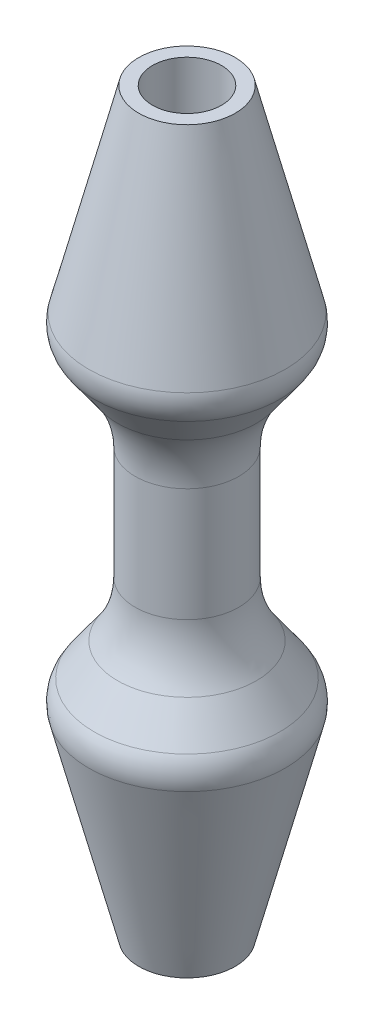
ISO-10303-21;
HEADER;
FILE_DESCRIPTION(('STEP AP214'),'2;1');
FILE_NAME('part.step','',(''),(''),'','','');
FILE_SCHEMA(('AUTOMOTIVE_DESIGN { 1 0 10303 214 1 1 1 1 }'));
ENDSEC;
DATA;
#1=APPLICATION_CONTEXT('core data for automotive mechanical design processes');
#2=APPLICATION_PROTOCOL_DEFINITION('international standard','automotive_design',2000,#1);
#3=PRODUCT_CONTEXT('',#1,'mechanical');
#4=PRODUCT('Part','Part','',(#3));
#5=PRODUCT_RELATED_PRODUCT_CATEGORY('part','',(#4));
#6=PRODUCT_DEFINITION_FORMATION('','',#4);
#7=PRODUCT_DEFINITION_CONTEXT('part definition',#1,'design');
#8=PRODUCT_DEFINITION('design','',#6,#7);
#9=PRODUCT_DEFINITION_SHAPE('','',#8);
#10=(LENGTH_UNIT() NAMED_UNIT(*) SI_UNIT(.MILLI.,.METRE.));
#11=(NAMED_UNIT(*) PLANE_ANGLE_UNIT() SI_UNIT($,.RADIAN.));
#12=(NAMED_UNIT(*) SI_UNIT($,.STERADIAN.) SOLID_ANGLE_UNIT());
#13=UNCERTAINTY_MEASURE_WITH_UNIT(LENGTH_MEASURE(1.E-05),#10,'distance_accuracy_value','');
#14=(GEOMETRIC_REPRESENTATION_CONTEXT(3) GLOBAL_UNCERTAINTY_ASSIGNED_CONTEXT((#13)) GLOBAL_UNIT_ASSIGNED_CONTEXT((#10,
#11,#12)) REPRESENTATION_CONTEXT('',''));
#15=CARTESIAN_POINT('',(0.,0.,0.));
#16=DIRECTION('',(0.,0.,1.));
#17=DIRECTION('',(1.,0.,0.));
#18=AXIS2_PLACEMENT_3D('',#15,#16,#17);
#19=CARTESIAN_POINT('',(0.,-4.5760973841928,0.));
#20=DIRECTION('',(0.,-1.,0.));
#21=DIRECTION('',(0.,0.,-1.));
#22=AXIS2_PLACEMENT_3D('',#19,#20,#21);
#23=TOROIDAL_SURFACE('',#22,12.6495085019331,8.1495085019331);
#24=CARTESIAN_POINT('',(0.,-4.5760973841928,0.));
#25=DIRECTION('',(0.,-1.,0.));
#26=DIRECTION('',(0.,0.,-1.));
#27=AXIS2_PLACEMENT_3D('',#24,#25,#26);
#28=CIRCLE('',#27,4.5);
#29=CARTESIAN_POINT('',(0.,-4.5760973841928,-4.5));
#30=VERTEX_POINT('',#29);
#31=EDGE_CURVE('E47',#30,#30,#28,.T.);
#32=ORIENTED_EDGE('',*,*,#31,.F.);
#33=EDGE_LOOP('',(#32));
#34=FACE_BOUND('',#33,.T.);
#35=CARTESIAN_POINT('',(0.,0.182825887896068,0.));
#36=DIRECTION('',(0.,-1.,0.));
#37=DIRECTION('',(0.,0.,-1.));
#38=AXIS2_PLACEMENT_3D('',#35,#36,#37);
#39=CIRCLE('',#38,6.03383483151595);
#40=CARTESIAN_POINT('',(0.,0.182825887896068,-6.03383483151595));
#41=VERTEX_POINT('',#40);
#42=EDGE_CURVE('E10',#41,#41,#39,.F.);
#43=ORIENTED_EDGE('',*,*,#42,.F.);
#44=EDGE_LOOP('',(#43));
#45=FACE_BOUND('',#44,.T.);
#46=ADVANCED_FACE('F39',(#34,#45),#23,.F.);
#47=CARTESIAN_POINT('',(0.,4.76414947373861,0.));
#48=DIRECTION('',(0.,1.,0.));
#49=DIRECTION('',(0.,0.,1.));
#50=AXIS2_PLACEMENT_3D('',#47,#48,#49);
#51=TOROIDAL_SURFACE('',#50,5.63382143786911,3.);
#52=CARTESIAN_POINT('',(0.,3.01229292768064,0.));
#53=DIRECTION('',(0.,-1.,0.));
#54=DIRECTION('',(0.,0.,-1.));
#55=AXIS2_PLACEMENT_3D('',#52,#53,#54);
#56=CIRCLE('',#55,8.06918560817996);
#57=CARTESIAN_POINT('',(0.,3.01229292768064,-8.06918560817996));
#58=VERTEX_POINT('',#57);
#59=EDGE_CURVE('E57',#58,#58,#56,.T.);
#60=ORIENTED_EDGE('',*,*,#59,.F.);
#61=EDGE_LOOP('',(#60));
#62=FACE_BOUND('',#61,.T.);
#63=CARTESIAN_POINT('',(0.,5.50367498162197,0.));
#64=DIRECTION('',(0.,1.,0.));
#65=DIRECTION('',(0.,0.,1.));
#66=AXIS2_PLACEMENT_3D('',#63,#64,#65);
#67=CIRCLE('',#66,8.54124332386878);
#68=CARTESIAN_POINT('',(0.,5.50367498162197,8.54124332386878));
#69=VERTEX_POINT('',#68);
#70=EDGE_CURVE('E52',#69,#69,#67,.T.);
#71=ORIENTED_EDGE('',*,*,#70,.F.);
#72=EDGE_LOOP('',(#71));
#73=FACE_BOUND('',#72,.T.);
#74=ADVANCED_FACE('F110',(#62,#73),#51,.T.);
#75=CARTESIAN_POINT('',(0.,22.5979958944993,0.));
#76=DIRECTION('',(0.,1.,0.));
#77=DIRECTION('',(0.,0.,1.));
#78=AXIS2_PLACEMENT_3D('',#75,#76,#77);
#79=PLANE('',#78);
#80=CARTESIAN_POINT('',(0.,22.5979958944993,0.));
#81=DIRECTION('',(0.,1.,0.));
#82=DIRECTION('',(0.,0.,1.));
#83=AXIS2_PLACEMENT_3D('',#80,#81,#82);
#84=CIRCLE('',#83,3.);
#85=CARTESIAN_POINT('',(0.,22.5979958944993,3.));
#86=VERTEX_POINT('',#85);
#87=EDGE_CURVE('E88',#86,#86,#84,.T.);
#88=ORIENTED_EDGE('',*,*,#87,.F.);
#89=EDGE_LOOP('',(#88));
#90=FACE_BOUND('',#89,.T.);
#91=CARTESIAN_POINT('',(0.,22.5979958944993,0.));
#92=DIRECTION('',(0.,-1.,0.));
#93=DIRECTION('',(0.,0.,-1.));
#94=AXIS2_PLACEMENT_3D('',#91,#92,#93);
#95=CIRCLE('',#94,4.19316903307146);
#96=CARTESIAN_POINT('',(0.,22.5979958944993,-4.19316903307146));
#97=VERTEX_POINT('',#96);
#98=EDGE_CURVE('E63',#97,#97,#95,.T.);
#99=ORIENTED_EDGE('',*,*,#98,.F.);
#100=EDGE_LOOP('',(#99));
#101=FACE_BOUND('',#100,.T.);
#102=ADVANCED_FACE('F106',(#90,#101),#79,.T.);
#103=CARTESIAN_POINT('',(0.,0.,0.));
#104=DIRECTION('',(0.,-1.,0.));
#105=DIRECTION('',(0.,0.,-1.));
#106=AXIS2_PLACEMENT_3D('',#103,#104,#105);
#107=CONICAL_SURFACE('',#106,9.94114612284268,0.249075921515313);
#108=ORIENTED_EDGE('',*,*,#70,.T.);
#109=EDGE_LOOP('',(#108));
#110=FACE_BOUND('',#109,.T.);
#111=ORIENTED_EDGE('',*,*,#98,.T.);
#112=EDGE_LOOP('',(#111));
#113=FACE_BOUND('',#112,.T.);
#114=ADVANCED_FACE('F109',(#110,#113),#107,.T.);
#115=CARTESIAN_POINT('',(0.,0.,0.));
#116=DIRECTION('',(0.,1.,0.));
#117=DIRECTION('',(0.,0.,1.));
#118=AXIS2_PLACEMENT_3D('',#115,#116,#117);
#119=CONICAL_SURFACE('',#118,5.90232073091279,0.623588704481849);
#120=ORIENTED_EDGE('',*,*,#42,.T.);
#121=EDGE_LOOP('',(#120));
#122=FACE_BOUND('',#121,.T.);
#123=ORIENTED_EDGE('',*,*,#59,.T.);
#124=EDGE_LOOP('',(#123));
#125=FACE_BOUND('',#124,.T.);
#126=ADVANCED_FACE('F115',(#122,#125),#119,.T.);
#127=CARTESIAN_POINT('',(0.,-9.5,0.));
#128=DIRECTION('',(0.,1.,0.));
#129=DIRECTION('',(0.,0.,1.));
#130=AXIS2_PLACEMENT_3D('',#127,#128,#129);
#131=CYLINDRICAL_SURFACE('',#130,4.5);
#132=ORIENTED_EDGE('',*,*,#31,.T.);
#133=EDGE_LOOP('',(#132));
#134=FACE_BOUND('',#133,.T.);
#135=CARTESIAN_POINT('',(0.,-14.4239026158072,0.));
#136=DIRECTION('',(0.,-1.,0.));
#137=DIRECTION('',(0.,0.,-1.));
#138=AXIS2_PLACEMENT_3D('',#135,#136,#137);
#139=CIRCLE('',#138,4.5);
#140=CARTESIAN_POINT('',(0.,-14.4239026158072,-4.5));
#141=VERTEX_POINT('',#140);
#142=EDGE_CURVE('E71',#141,#141,#139,.T.);
#143=ORIENTED_EDGE('',*,*,#142,.F.);
#144=EDGE_LOOP('',(#143));
#145=FACE_BOUND('',#144,.T.);
#146=ADVANCED_FACE('F121',(#134,#145),#131,.T.);
#147=CARTESIAN_POINT('',(0.,-14.4239026158072,0.));
#148=DIRECTION('',(0.,1.,0.));
#149=DIRECTION('',(0.,0.,-1.));
#150=AXIS2_PLACEMENT_3D('',#147,#148,#149);
#151=TOROIDAL_SURFACE('',#150,12.6495085019331,8.1495085019331);
#152=ORIENTED_EDGE('',*,*,#142,.T.);
#153=EDGE_LOOP('',(#152));
#154=FACE_BOUND('',#153,.T.);
#155=CARTESIAN_POINT('',(0.,-19.1828258878961,0.));
#156=DIRECTION('',(0.,-1.,0.));
#157=DIRECTION('',(0.,0.,-1.));
#158=AXIS2_PLACEMENT_3D('',#155,#156,#157);
#159=CIRCLE('',#158,6.03383483151595);
#160=CARTESIAN_POINT('',(0.,-19.1828258878961,-6.03383483151595));
#161=VERTEX_POINT('',#160);
#162=EDGE_CURVE('E67',#161,#161,#159,.F.);
#163=ORIENTED_EDGE('',*,*,#162,.T.);
#164=EDGE_LOOP('',(#163));
#165=FACE_BOUND('',#164,.T.);
#166=ADVANCED_FACE('F188',(#154,#165),#151,.F.);
#167=CARTESIAN_POINT('',(0.,-23.7641494737386,0.));
#168=DIRECTION('',(0.,-1.,0.));
#169=DIRECTION('',(0.,0.,1.));
#170=AXIS2_PLACEMENT_3D('',#167,#168,#169);
#171=TOROIDAL_SURFACE('',#170,5.63382143786911,3.);
#172=CARTESIAN_POINT('',(0.,-22.0122929276806,0.));
#173=DIRECTION('',(0.,-1.,0.));
#174=DIRECTION('',(0.,0.,-1.));
#175=AXIS2_PLACEMENT_3D('',#172,#173,#174);
#176=CIRCLE('',#175,8.06918560817996);
#177=CARTESIAN_POINT('',(0.,-22.0122929276806,-8.06918560817996));
#178=VERTEX_POINT('',#177);
#179=EDGE_CURVE('E79',#178,#178,#176,.T.);
#180=ORIENTED_EDGE('',*,*,#179,.T.);
#181=EDGE_LOOP('',(#180));
#182=FACE_BOUND('',#181,.T.);
#183=CARTESIAN_POINT('',(0.,-24.503674981622,0.));
#184=DIRECTION('',(0.,1.,0.));
#185=DIRECTION('',(0.,0.,1.));
#186=AXIS2_PLACEMENT_3D('',#183,#184,#185);
#187=CIRCLE('',#186,8.54124332386878);
#188=CARTESIAN_POINT('',(0.,-24.503674981622,8.54124332386878));
#189=VERTEX_POINT('',#188);
#190=EDGE_CURVE('E75',#189,#189,#187,.T.);
#191=ORIENTED_EDGE('',*,*,#190,.T.);
#192=EDGE_LOOP('',(#191));
#193=FACE_BOUND('',#192,.T.);
#194=ADVANCED_FACE('F162',(#182,#193),#171,.T.);
#195=CARTESIAN_POINT('',(0.,-41.5979958944993,0.));
#196=DIRECTION('',(0.,-1.,0.));
#197=DIRECTION('',(0.,0.,1.));
#198=AXIS2_PLACEMENT_3D('',#195,#196,#197);
#199=PLANE('',#198);
#200=CARTESIAN_POINT('',(0.,-41.5979958944992,0.));
#201=DIRECTION('',(0.,1.,0.));
#202=DIRECTION('',(0.,0.,1.));
#203=AXIS2_PLACEMENT_3D('',#200,#201,#202);
#204=CIRCLE('',#203,3.);
#205=CARTESIAN_POINT('',(0.,-41.5979958944992,3.));
#206=VERTEX_POINT('',#205);
#207=EDGE_CURVE('E87',#206,#206,#204,.T.);
#208=ORIENTED_EDGE('',*,*,#207,.T.);
#209=EDGE_LOOP('',(#208));
#210=FACE_BOUND('',#209,.T.);
#211=CARTESIAN_POINT('',(0.,-41.5979958944993,0.));
#212=DIRECTION('',(0.,-1.,0.));
#213=DIRECTION('',(0.,0.,-1.));
#214=AXIS2_PLACEMENT_3D('',#211,#212,#213);
#215=CIRCLE('',#214,4.19316903307146);
#216=CARTESIAN_POINT('',(0.,-41.5979958944993,-4.19316903307146));
#217=VERTEX_POINT('',#216);
#218=EDGE_CURVE('E83',#217,#217,#215,.T.);
#219=ORIENTED_EDGE('',*,*,#218,.T.);
#220=EDGE_LOOP('',(#219));
#221=FACE_BOUND('',#220,.T.);
#222=ADVANCED_FACE('F96',(#210,#221),#199,.T.);
#223=CARTESIAN_POINT('',(0.,-19.,0.));
#224=DIRECTION('',(0.,1.,0.));
#225=DIRECTION('',(0.,0.,-1.));
#226=AXIS2_PLACEMENT_3D('',#223,#224,#225);
#227=CONICAL_SURFACE('',#226,9.94114612284268,0.249075921515313);
#228=ORIENTED_EDGE('',*,*,#190,.F.);
#229=EDGE_LOOP('',(#228));
#230=FACE_BOUND('',#229,.T.);
#231=ORIENTED_EDGE('',*,*,#218,.F.);
#232=EDGE_LOOP('',(#231));
#233=FACE_BOUND('',#232,.T.);
#234=ADVANCED_FACE('F161',(#230,#233),#227,.T.);
#235=CARTESIAN_POINT('',(0.,-19.,0.));
#236=DIRECTION('',(0.,-1.,0.));
#237=DIRECTION('',(0.,0.,1.));
#238=AXIS2_PLACEMENT_3D('',#235,#236,#237);
#239=CONICAL_SURFACE('',#238,5.90232073091279,0.623588704481849);
#240=ORIENTED_EDGE('',*,*,#162,.F.);
#241=EDGE_LOOP('',(#240));
#242=FACE_BOUND('',#241,.T.);
#243=ORIENTED_EDGE('',*,*,#179,.F.);
#244=EDGE_LOOP('',(#243));
#245=FACE_BOUND('',#244,.T.);
#246=ADVANCED_FACE('F102',(#242,#245),#239,.T.);
#247=CARTESIAN_POINT('',(0.,-41.5979958944992,0.));
#248=DIRECTION('',(0.,1.,0.));
#249=DIRECTION('',(0.,0.,1.));
#250=AXIS2_PLACEMENT_3D('',#247,#248,#249);
#251=CYLINDRICAL_SURFACE('',#250,3.);
#252=ORIENTED_EDGE('',*,*,#207,.F.);
#253=EDGE_LOOP('',(#252));
#254=FACE_BOUND('',#253,.T.);
#255=ORIENTED_EDGE('',*,*,#87,.T.);
#256=EDGE_LOOP('',(#255));
#257=FACE_BOUND('',#256,.T.);
#258=ADVANCED_FACE('F99',(#254,#257),#251,.F.);
#259=CLOSED_SHELL('',(#46,#74,#102,#114,#126,#146,#166,#194,#222,#234,#246,#258));
#260=MANIFOLD_SOLID_BREP('B2',#259);
#261=ADVANCED_BREP_SHAPE_REPRESENTATION('',(#18,#260),#14);
#262=SHAPE_DEFINITION_REPRESENTATION(#9,#261);
ENDSEC;
END-ISO-10303-21;
